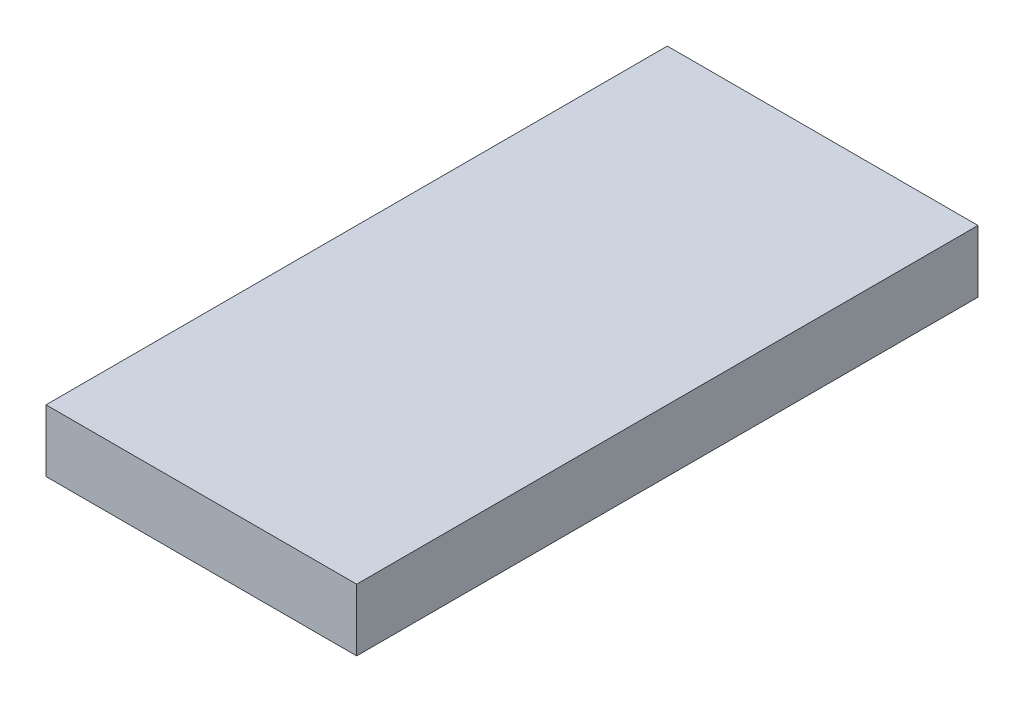
ISO-10303-21;
HEADER;
FILE_DESCRIPTION(('STEP AP214'),'2;1');
FILE_NAME('part.step','',(''),(''),'','','');
FILE_SCHEMA(('AUTOMOTIVE_DESIGN { 1 0 10303 214 1 1 1 1 }'));
ENDSEC;
DATA;
#1=APPLICATION_CONTEXT('core data for automotive mechanical design processes');
#2=APPLICATION_PROTOCOL_DEFINITION('international standard','automotive_design',2000,#1);
#3=PRODUCT_CONTEXT('',#1,'mechanical');
#4=PRODUCT('Part','Part','',(#3));
#5=PRODUCT_RELATED_PRODUCT_CATEGORY('part','',(#4));
#6=PRODUCT_DEFINITION_FORMATION('','',#4);
#7=PRODUCT_DEFINITION_CONTEXT('part definition',#1,'design');
#8=PRODUCT_DEFINITION('design','',#6,#7);
#9=PRODUCT_DEFINITION_SHAPE('','',#8);
#10=(LENGTH_UNIT() NAMED_UNIT(*) SI_UNIT(.MILLI.,.METRE.));
#11=(NAMED_UNIT(*) PLANE_ANGLE_UNIT() SI_UNIT($,.RADIAN.));
#12=(NAMED_UNIT(*) SI_UNIT($,.STERADIAN.) SOLID_ANGLE_UNIT());
#13=UNCERTAINTY_MEASURE_WITH_UNIT(LENGTH_MEASURE(1.E-05),#10,'distance_accuracy_value','');
#14=(GEOMETRIC_REPRESENTATION_CONTEXT(3) GLOBAL_UNCERTAINTY_ASSIGNED_CONTEXT((#13)) GLOBAL_UNIT_ASSIGNED_CONTEXT((#10,
#11,#12)) REPRESENTATION_CONTEXT('',''));
#15=CARTESIAN_POINT('',(0.,0.,0.));
#16=DIRECTION('',(0.,0.,1.));
#17=DIRECTION('',(1.,0.,0.));
#18=AXIS2_PLACEMENT_3D('',#15,#16,#17);
#19=CARTESIAN_POINT('',(-30.,12.,60.));
#20=DIRECTION('',(1.,0.,0.));
#21=DIRECTION('',(0.,0.,-1.));
#22=AXIS2_PLACEMENT_3D('',#19,#20,#21);
#23=PLANE('',#22);
#24=DIRECTION('',(0.,0.,1.));
#25=VECTOR('',#24,1.);
#26=CARTESIAN_POINT('',(-30.,0.,60.));
#27=LINE('',#26,#25);
#28=CARTESIAN_POINT('',(-30.,0.,-60.));
#29=VERTEX_POINT('',#28);
#30=CARTESIAN_POINT('',(-30.,0.,60.));
#31=VERTEX_POINT('',#30);
#32=EDGE_CURVE('E96',#29,#31,#27,.T.);
#33=ORIENTED_EDGE('',*,*,#32,.T.);
#34=DIRECTION('',(0.,-1.,0.));
#35=VECTOR('',#34,1.);
#36=CARTESIAN_POINT('',(-30.,12.,60.));
#37=LINE('',#36,#35);
#38=CARTESIAN_POINT('',(-30.,12.,60.));
#39=VERTEX_POINT('',#38);
#40=EDGE_CURVE('E11',#39,#31,#37,.T.);
#41=ORIENTED_EDGE('',*,*,#40,.F.);
#42=DIRECTION('',(0.,0.,1.));
#43=VECTOR('',#42,1.);
#44=CARTESIAN_POINT('',(-30.,12.,60.));
#45=LINE('',#44,#43);
#46=CARTESIAN_POINT('',(-30.,12.,-60.));
#47=VERTEX_POINT('',#46);
#48=EDGE_CURVE('E84',#47,#39,#45,.T.);
#49=ORIENTED_EDGE('',*,*,#48,.F.);
#50=DIRECTION('',(0.,-1.,0.));
#51=VECTOR('',#50,1.);
#52=CARTESIAN_POINT('',(-30.,12.,-60.));
#53=LINE('',#52,#51);
#54=EDGE_CURVE('E92',#47,#29,#53,.T.);
#55=ORIENTED_EDGE('',*,*,#54,.T.);
#56=EDGE_LOOP('',(#33,#41,#49,#55));
#57=FACE_BOUND('',#56,.T.);
#58=ADVANCED_FACE('F33',(#57),#23,.F.);
#59=CARTESIAN_POINT('',(30.,12.,60.));
#60=DIRECTION('',(0.,0.,-1.));
#61=DIRECTION('',(-1.,0.,0.));
#62=AXIS2_PLACEMENT_3D('',#59,#60,#61);
#63=PLANE('',#62);
#64=DIRECTION('',(1.,0.,0.));
#65=VECTOR('',#64,1.);
#66=CARTESIAN_POINT('',(30.,0.,60.));
#67=LINE('',#66,#65);
#68=CARTESIAN_POINT('',(30.,0.,60.));
#69=VERTEX_POINT('',#68);
#70=EDGE_CURVE('E88',#31,#69,#67,.T.);
#71=ORIENTED_EDGE('',*,*,#70,.T.);
#72=DIRECTION('',(0.,-1.,0.));
#73=VECTOR('',#72,1.);
#74=CARTESIAN_POINT('',(30.,12.,60.));
#75=LINE('',#74,#73);
#76=CARTESIAN_POINT('',(30.,12.,60.));
#77=VERTEX_POINT('',#76);
#78=EDGE_CURVE('E41',#77,#69,#75,.T.);
#79=ORIENTED_EDGE('',*,*,#78,.F.);
#80=DIRECTION('',(1.,0.,0.));
#81=VECTOR('',#80,1.);
#82=CARTESIAN_POINT('',(30.,12.,60.));
#83=LINE('',#82,#81);
#84=EDGE_CURVE('E79',#39,#77,#83,.T.);
#85=ORIENTED_EDGE('',*,*,#84,.F.);
#86=ORIENTED_EDGE('',*,*,#40,.T.);
#87=EDGE_LOOP('',(#71,#79,#85,#86));
#88=FACE_BOUND('',#87,.T.);
#89=ADVANCED_FACE('F87',(#88),#63,.F.);
#90=CARTESIAN_POINT('',(30.,12.,-60.));
#91=DIRECTION('',(-1.,0.,0.));
#92=DIRECTION('',(0.,0.,1.));
#93=AXIS2_PLACEMENT_3D('',#90,#91,#92);
#94=PLANE('',#93);
#95=DIRECTION('',(0.,0.,-1.));
#96=VECTOR('',#95,1.);
#97=CARTESIAN_POINT('',(30.,0.,-60.));
#98=LINE('',#97,#96);
#99=CARTESIAN_POINT('',(30.,0.,-60.));
#100=VERTEX_POINT('',#99);
#101=EDGE_CURVE('E66',#69,#100,#98,.T.);
#102=ORIENTED_EDGE('',*,*,#101,.T.);
#103=DIRECTION('',(0.,-1.,0.));
#104=VECTOR('',#103,1.);
#105=CARTESIAN_POINT('',(30.,12.,-60.));
#106=LINE('',#105,#104);
#107=CARTESIAN_POINT('',(30.,12.,-60.));
#108=VERTEX_POINT('',#107);
#109=EDGE_CURVE('E89',#108,#100,#106,.T.);
#110=ORIENTED_EDGE('',*,*,#109,.F.);
#111=DIRECTION('',(0.,0.,-1.));
#112=VECTOR('',#111,1.);
#113=CARTESIAN_POINT('',(30.,12.,-60.));
#114=LINE('',#113,#112);
#115=EDGE_CURVE('E82',#77,#108,#114,.T.);
#116=ORIENTED_EDGE('',*,*,#115,.F.);
#117=ORIENTED_EDGE('',*,*,#78,.T.);
#118=EDGE_LOOP('',(#102,#110,#116,#117));
#119=FACE_BOUND('',#118,.T.);
#120=ADVANCED_FACE('F90',(#119),#94,.F.);
#121=CARTESIAN_POINT('',(-30.,12.,-60.));
#122=DIRECTION('',(0.,0.,1.));
#123=DIRECTION('',(1.,0.,0.));
#124=AXIS2_PLACEMENT_3D('',#121,#122,#123);
#125=PLANE('',#124);
#126=DIRECTION('',(-1.,0.,0.));
#127=VECTOR('',#126,1.);
#128=CARTESIAN_POINT('',(-30.,0.,-60.));
#129=LINE('',#128,#127);
#130=EDGE_CURVE('E72',#100,#29,#129,.T.);
#131=ORIENTED_EDGE('',*,*,#130,.T.);
#132=ORIENTED_EDGE('',*,*,#54,.F.);
#133=DIRECTION('',(-1.,0.,0.));
#134=VECTOR('',#133,1.);
#135=CARTESIAN_POINT('',(-30.,12.,-60.));
#136=LINE('',#135,#134);
#137=EDGE_CURVE('E49',#108,#47,#136,.T.);
#138=ORIENTED_EDGE('',*,*,#137,.F.);
#139=ORIENTED_EDGE('',*,*,#109,.T.);
#140=EDGE_LOOP('',(#131,#132,#138,#139));
#141=FACE_BOUND('',#140,.T.);
#142=ADVANCED_FACE('F103',(#141),#125,.F.);
#143=CARTESIAN_POINT('',(0.,12.,0.));
#144=DIRECTION('',(0.,-1.,0.));
#145=DIRECTION('',(0.,0.,-1.));
#146=AXIS2_PLACEMENT_3D('',#143,#144,#145);
#147=PLANE('',#146);
#148=ORIENTED_EDGE('',*,*,#48,.T.);
#149=ORIENTED_EDGE('',*,*,#84,.T.);
#150=ORIENTED_EDGE('',*,*,#115,.T.);
#151=ORIENTED_EDGE('',*,*,#137,.T.);
#152=EDGE_LOOP('',(#148,#149,#150,#151));
#153=FACE_BOUND('',#152,.T.);
#154=ADVANCED_FACE('F80',(#153),#147,.F.);
#155=CARTESIAN_POINT('',(0.,0.,0.));
#156=DIRECTION('',(0.,-1.,0.));
#157=DIRECTION('',(0.,0.,-1.));
#158=AXIS2_PLACEMENT_3D('',#155,#156,#157);
#159=PLANE('',#158);
#160=ORIENTED_EDGE('',*,*,#32,.F.);
#161=ORIENTED_EDGE('',*,*,#130,.F.);
#162=ORIENTED_EDGE('',*,*,#101,.F.);
#163=ORIENTED_EDGE('',*,*,#70,.F.);
#164=EDGE_LOOP('',(#160,#161,#162,#163));
#165=FACE_BOUND('',#164,.T.);
#166=ADVANCED_FACE('F106',(#165),#159,.T.);
#167=CLOSED_SHELL('',(#58,#89,#120,#142,#154,#166));
#168=MANIFOLD_SOLID_BREP('B2',#167);
#169=ADVANCED_BREP_SHAPE_REPRESENTATION('',(#18,#168),#14);
#170=SHAPE_DEFINITION_REPRESENTATION(#9,#169);
ENDSEC;
END-ISO-10303-21;
